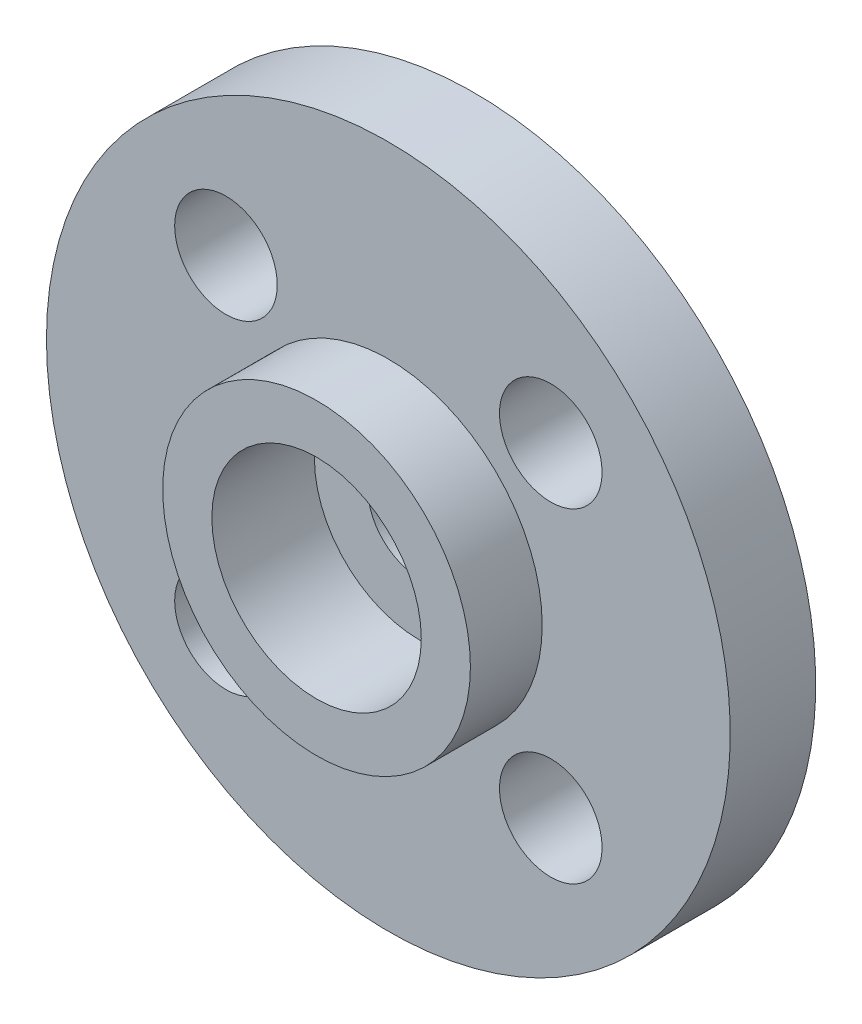
ISO-10303-21;
HEADER;
FILE_DESCRIPTION(('STEP AP214'),'2;1');
FILE_NAME('part.step','',(''),(''),'','','');
FILE_SCHEMA(('AUTOMOTIVE_DESIGN { 1 0 10303 214 1 1 1 1 }'));
ENDSEC;
DATA;
#1=APPLICATION_CONTEXT('core data for automotive mechanical design processes');
#2=APPLICATION_PROTOCOL_DEFINITION('international standard','automotive_design',2000,#1);
#3=PRODUCT_CONTEXT('',#1,'mechanical');
#4=PRODUCT('Part','Part','',(#3));
#5=PRODUCT_RELATED_PRODUCT_CATEGORY('part','',(#4));
#6=PRODUCT_DEFINITION_FORMATION('','',#4);
#7=PRODUCT_DEFINITION_CONTEXT('part definition',#1,'design');
#8=PRODUCT_DEFINITION('design','',#6,#7);
#9=PRODUCT_DEFINITION_SHAPE('','',#8);
#10=(LENGTH_UNIT() NAMED_UNIT(*) SI_UNIT(.MILLI.,.METRE.));
#11=(NAMED_UNIT(*) PLANE_ANGLE_UNIT() SI_UNIT($,.RADIAN.));
#12=(NAMED_UNIT(*) SI_UNIT($,.STERADIAN.) SOLID_ANGLE_UNIT());
#13=UNCERTAINTY_MEASURE_WITH_UNIT(LENGTH_MEASURE(1.E-05),#10,'distance_accuracy_value','');
#14=(GEOMETRIC_REPRESENTATION_CONTEXT(3) GLOBAL_UNCERTAINTY_ASSIGNED_CONTEXT((#13)) GLOBAL_UNIT_ASSIGNED_CONTEXT((#10,
#11,#12)) REPRESENTATION_CONTEXT('',''));
#15=CARTESIAN_POINT('',(0.,0.,0.));
#16=DIRECTION('',(0.,0.,1.));
#17=DIRECTION('',(1.,0.,0.));
#18=AXIS2_PLACEMENT_3D('',#15,#16,#17);
#19=CARTESIAN_POINT('',(0.,0.,2.5));
#20=DIRECTION('',(0.,0.,-1.));
#21=DIRECTION('',(-1.,0.,0.));
#22=AXIS2_PLACEMENT_3D('',#19,#20,#21);
#23=CYLINDRICAL_SURFACE('',#22,10.);
#24=CARTESIAN_POINT('',(0.,0.,2.5));
#25=DIRECTION('',(0.,0.,-1.));
#26=DIRECTION('',(-1.,0.,0.));
#27=AXIS2_PLACEMENT_3D('',#24,#25,#26);
#28=CIRCLE('',#27,10.);
#29=CARTESIAN_POINT('',(-10.,0.,2.5));
#30=VERTEX_POINT('',#29);
#31=EDGE_CURVE('E46',#30,#30,#28,.T.);
#32=ORIENTED_EDGE('',*,*,#31,.T.);
#33=EDGE_LOOP('',(#32));
#34=FACE_BOUND('',#33,.T.);
#35=CARTESIAN_POINT('',(0.,0.,0.));
#36=DIRECTION('',(0.,0.,-1.));
#37=DIRECTION('',(-1.,0.,0.));
#38=AXIS2_PLACEMENT_3D('',#35,#36,#37);
#39=CIRCLE('',#38,10.);
#40=CARTESIAN_POINT('',(-10.,0.,0.));
#41=VERTEX_POINT('',#40);
#42=EDGE_CURVE('E51',#41,#41,#39,.T.);
#43=ORIENTED_EDGE('',*,*,#42,.F.);
#44=EDGE_LOOP('',(#43));
#45=FACE_BOUND('',#44,.T.);
#46=ADVANCED_FACE('F39',(#34,#45),#23,.T.);
#47=CARTESIAN_POINT('',(10.,0.,2.5));
#48=DIRECTION('',(0.,0.,1.));
#49=DIRECTION('',(1.,0.,0.));
#50=AXIS2_PLACEMENT_3D('',#47,#48,#49);
#51=PLANE('',#50);
#52=CARTESIAN_POINT('',(4.75,-4.75,2.5));
#53=DIRECTION('',(0.,0.,1.));
#54=DIRECTION('',(1.,0.,0.));
#55=AXIS2_PLACEMENT_3D('',#52,#53,#54);
#56=CIRCLE('',#55,1.49999999999999);
#57=CARTESIAN_POINT('',(6.24999999999999,-4.75,2.5));
#58=VERTEX_POINT('',#57);
#59=EDGE_CURVE('E42',#58,#58,#56,.T.);
#60=ORIENTED_EDGE('',*,*,#59,.F.);
#61=EDGE_LOOP('',(#60));
#62=FACE_BOUND('',#61,.T.);
#63=CARTESIAN_POINT('',(-4.75,-4.75,2.5));
#64=DIRECTION('',(0.,0.,1.));
#65=DIRECTION('',(1.,0.,0.));
#66=AXIS2_PLACEMENT_3D('',#63,#64,#65);
#67=CIRCLE('',#66,1.49999999999999);
#68=CARTESIAN_POINT('',(-3.25000000000001,-4.75,2.5));
#69=VERTEX_POINT('',#68);
#70=EDGE_CURVE('E76',#69,#69,#67,.T.);
#71=ORIENTED_EDGE('',*,*,#70,.F.);
#72=EDGE_LOOP('',(#71));
#73=FACE_BOUND('',#72,.T.);
#74=CARTESIAN_POINT('',(-4.75,4.75,2.5));
#75=DIRECTION('',(0.,0.,1.));
#76=DIRECTION('',(1.,0.,0.));
#77=AXIS2_PLACEMENT_3D('',#74,#75,#76);
#78=CIRCLE('',#77,1.49999999999999);
#79=CARTESIAN_POINT('',(-3.25000000000001,4.75,2.5));
#80=VERTEX_POINT('',#79);
#81=EDGE_CURVE('E68',#80,#80,#78,.T.);
#82=ORIENTED_EDGE('',*,*,#81,.F.);
#83=EDGE_LOOP('',(#82));
#84=FACE_BOUND('',#83,.T.);
#85=CARTESIAN_POINT('',(4.75,4.75,2.5));
#86=DIRECTION('',(0.,0.,1.));
#87=DIRECTION('',(1.,0.,0.));
#88=AXIS2_PLACEMENT_3D('',#85,#86,#87);
#89=CIRCLE('',#88,1.49999999999999);
#90=CARTESIAN_POINT('',(6.24999999999999,4.75,2.5));
#91=VERTEX_POINT('',#90);
#92=EDGE_CURVE('E60',#91,#91,#89,.T.);
#93=ORIENTED_EDGE('',*,*,#92,.F.);
#94=EDGE_LOOP('',(#93));
#95=FACE_BOUND('',#94,.T.);
#96=CARTESIAN_POINT('',(0.,0.,2.5));
#97=DIRECTION('',(0.,0.,1.));
#98=DIRECTION('',(1.,0.,0.));
#99=AXIS2_PLACEMENT_3D('',#96,#97,#98);
#100=CIRCLE('',#99,4.5);
#101=CARTESIAN_POINT('',(4.5,0.,2.5));
#102=VERTEX_POINT('',#101);
#103=EDGE_CURVE('E10',#102,#102,#100,.T.);
#104=ORIENTED_EDGE('',*,*,#103,.F.);
#105=EDGE_LOOP('',(#104));
#106=FACE_BOUND('',#105,.T.);
#107=ORIENTED_EDGE('',*,*,#31,.F.);
#108=EDGE_LOOP('',(#107));
#109=FACE_BOUND('',#108,.T.);
#110=ADVANCED_FACE('F115',(#62,#73,#84,#95,#106,#109),#51,.T.);
#111=CARTESIAN_POINT('',(0.,0.,0.));
#112=DIRECTION('',(0.,0.,-1.));
#113=DIRECTION('',(-1.,0.,0.));
#114=AXIS2_PLACEMENT_3D('',#111,#112,#113);
#115=PLANE('',#114);
#116=CARTESIAN_POINT('',(0.,0.,0.));
#117=DIRECTION('',(0.,0.,1.));
#118=DIRECTION('',(1.,0.,0.));
#119=AXIS2_PLACEMENT_3D('',#116,#117,#118);
#120=CIRCLE('',#119,1.50000000000001);
#121=CARTESIAN_POINT('',(1.50000000000001,0.,0.));
#122=VERTEX_POINT('',#121);
#123=EDGE_CURVE('E85',#122,#122,#120,.T.);
#124=ORIENTED_EDGE('',*,*,#123,.T.);
#125=EDGE_LOOP('',(#124));
#126=FACE_BOUND('',#125,.T.);
#127=CARTESIAN_POINT('',(4.75,-4.75,0.));
#128=DIRECTION('',(0.,0.,-1.));
#129=DIRECTION('',(-1.,0.,0.));
#130=AXIS2_PLACEMENT_3D('',#127,#128,#129);
#131=CIRCLE('',#130,1.49999999999999);
#132=CARTESIAN_POINT('',(3.25000000000001,-4.75,0.));
#133=VERTEX_POINT('',#132);
#134=EDGE_CURVE('E82',#133,#133,#131,.T.);
#135=ORIENTED_EDGE('',*,*,#134,.F.);
#136=EDGE_LOOP('',(#135));
#137=FACE_BOUND('',#136,.T.);
#138=CARTESIAN_POINT('',(-4.75,-4.75,0.));
#139=DIRECTION('',(0.,0.,-1.));
#140=DIRECTION('',(-1.,0.,0.));
#141=AXIS2_PLACEMENT_3D('',#138,#139,#140);
#142=CIRCLE('',#141,1.49999999999999);
#143=CARTESIAN_POINT('',(-6.24999999999999,-4.75,0.));
#144=VERTEX_POINT('',#143);
#145=EDGE_CURVE('E79',#144,#144,#142,.T.);
#146=ORIENTED_EDGE('',*,*,#145,.F.);
#147=EDGE_LOOP('',(#146));
#148=FACE_BOUND('',#147,.T.);
#149=CARTESIAN_POINT('',(-4.75,4.75,0.));
#150=DIRECTION('',(0.,0.,-1.));
#151=DIRECTION('',(-1.,0.,0.));
#152=AXIS2_PLACEMENT_3D('',#149,#150,#151);
#153=CIRCLE('',#152,1.49999999999999);
#154=CARTESIAN_POINT('',(-6.24999999999999,4.75,0.));
#155=VERTEX_POINT('',#154);
#156=EDGE_CURVE('E73',#155,#155,#153,.T.);
#157=ORIENTED_EDGE('',*,*,#156,.F.);
#158=EDGE_LOOP('',(#157));
#159=FACE_BOUND('',#158,.T.);
#160=CARTESIAN_POINT('',(4.75,4.75,0.));
#161=DIRECTION('',(0.,0.,-1.));
#162=DIRECTION('',(-1.,0.,0.));
#163=AXIS2_PLACEMENT_3D('',#160,#161,#162);
#164=CIRCLE('',#163,1.49999999999999);
#165=CARTESIAN_POINT('',(3.25000000000001,4.75,0.));
#166=VERTEX_POINT('',#165);
#167=EDGE_CURVE('E64',#166,#166,#164,.T.);
#168=ORIENTED_EDGE('',*,*,#167,.F.);
#169=EDGE_LOOP('',(#168));
#170=FACE_BOUND('',#169,.T.);
#171=ORIENTED_EDGE('',*,*,#42,.T.);
#172=EDGE_LOOP('',(#171));
#173=FACE_BOUND('',#172,.T.);
#174=ADVANCED_FACE('F111',(#126,#137,#148,#159,#170,#173),#115,.T.);
#175=CARTESIAN_POINT('',(0.,0.,4.6));
#176=DIRECTION('',(0.,0.,-1.));
#177=DIRECTION('',(-1.,0.,0.));
#178=AXIS2_PLACEMENT_3D('',#175,#176,#177);
#179=CYLINDRICAL_SURFACE('',#178,4.5);
#180=CARTESIAN_POINT('',(0.,0.,4.6));
#181=DIRECTION('',(0.,0.,1.));
#182=DIRECTION('',(1.,0.,0.));
#183=AXIS2_PLACEMENT_3D('',#180,#181,#182);
#184=CIRCLE('',#183,4.5);
#185=CARTESIAN_POINT('',(4.5,0.,4.6));
#186=VERTEX_POINT('',#185);
#187=EDGE_CURVE('E54',#186,#186,#184,.T.);
#188=ORIENTED_EDGE('',*,*,#187,.F.);
#189=EDGE_LOOP('',(#188));
#190=FACE_BOUND('',#189,.T.);
#191=ORIENTED_EDGE('',*,*,#103,.T.);
#192=EDGE_LOOP('',(#191));
#193=FACE_BOUND('',#192,.T.);
#194=ADVANCED_FACE('F103',(#190,#193),#179,.T.);
#195=CARTESIAN_POINT('',(0.,0.,4.6));
#196=DIRECTION('',(0.,0.,1.));
#197=DIRECTION('',(1.,0.,0.));
#198=AXIS2_PLACEMENT_3D('',#195,#196,#197);
#199=PLANE('',#198);
#200=CARTESIAN_POINT('',(0.,0.,4.6));
#201=DIRECTION('',(0.,0.,1.));
#202=DIRECTION('',(1.,0.,0.));
#203=AXIS2_PLACEMENT_3D('',#200,#201,#202);
#204=CIRCLE('',#203,3.06304624364247);
#205=CARTESIAN_POINT('',(3.06304624364247,0.,4.6));
#206=VERTEX_POINT('',#205);
#207=EDGE_CURVE('E94',#206,#206,#204,.T.);
#208=ORIENTED_EDGE('',*,*,#207,.F.);
#209=EDGE_LOOP('',(#208));
#210=FACE_BOUND('',#209,.T.);
#211=ORIENTED_EDGE('',*,*,#187,.T.);
#212=EDGE_LOOP('',(#211));
#213=FACE_BOUND('',#212,.T.);
#214=ADVANCED_FACE('F100',(#210,#213),#199,.T.);
#215=CARTESIAN_POINT('',(4.75,4.75,0.));
#216=DIRECTION('',(0.,0.,-1.));
#217=DIRECTION('',(-1.,0.,0.));
#218=AXIS2_PLACEMENT_3D('',#215,#216,#217);
#219=CYLINDRICAL_SURFACE('',#218,1.49999999999999);
#220=ORIENTED_EDGE('',*,*,#92,.T.);
#221=EDGE_LOOP('',(#220));
#222=FACE_BOUND('',#221,.T.);
#223=ORIENTED_EDGE('',*,*,#167,.T.);
#224=EDGE_LOOP('',(#223));
#225=FACE_BOUND('',#224,.T.);
#226=ADVANCED_FACE('F102',(#222,#225),#219,.F.);
#227=CARTESIAN_POINT('',(-4.75,4.75,0.));
#228=DIRECTION('',(0.,0.,-1.));
#229=DIRECTION('',(-1.,0.,0.));
#230=AXIS2_PLACEMENT_3D('',#227,#228,#229);
#231=CYLINDRICAL_SURFACE('',#230,1.49999999999999);
#232=ORIENTED_EDGE('',*,*,#81,.T.);
#233=EDGE_LOOP('',(#232));
#234=FACE_BOUND('',#233,.T.);
#235=ORIENTED_EDGE('',*,*,#156,.T.);
#236=EDGE_LOOP('',(#235));
#237=FACE_BOUND('',#236,.T.);
#238=ADVANCED_FACE('F109',(#234,#237),#231,.F.);
#239=CARTESIAN_POINT('',(-4.75,-4.75,0.));
#240=DIRECTION('',(0.,0.,-1.));
#241=DIRECTION('',(-1.,0.,0.));
#242=AXIS2_PLACEMENT_3D('',#239,#240,#241);
#243=CYLINDRICAL_SURFACE('',#242,1.49999999999999);
#244=ORIENTED_EDGE('',*,*,#70,.T.);
#245=EDGE_LOOP('',(#244));
#246=FACE_BOUND('',#245,.T.);
#247=ORIENTED_EDGE('',*,*,#145,.T.);
#248=EDGE_LOOP('',(#247));
#249=FACE_BOUND('',#248,.T.);
#250=ADVANCED_FACE('F140',(#246,#249),#243,.F.);
#251=CARTESIAN_POINT('',(4.75,-4.75,0.));
#252=DIRECTION('',(0.,0.,-1.));
#253=DIRECTION('',(-1.,0.,0.));
#254=AXIS2_PLACEMENT_3D('',#251,#252,#253);
#255=CYLINDRICAL_SURFACE('',#254,1.49999999999999);
#256=ORIENTED_EDGE('',*,*,#59,.T.);
#257=EDGE_LOOP('',(#256));
#258=FACE_BOUND('',#257,.T.);
#259=ORIENTED_EDGE('',*,*,#134,.T.);
#260=EDGE_LOOP('',(#259));
#261=FACE_BOUND('',#260,.T.);
#262=ADVANCED_FACE('F150',(#258,#261),#255,.F.);
#263=CARTESIAN_POINT('',(0.,0.,4.6));
#264=DIRECTION('',(0.,0.,1.));
#265=DIRECTION('',(1.,0.,0.));
#266=AXIS2_PLACEMENT_3D('',#263,#264,#265);
#267=CYLINDRICAL_SURFACE('',#266,1.50000000000001);
#268=ORIENTED_EDGE('',*,*,#123,.F.);
#269=EDGE_LOOP('',(#268));
#270=FACE_BOUND('',#269,.T.);
#271=CARTESIAN_POINT('',(0.,0.,1.6));
#272=DIRECTION('',(0.,0.,1.));
#273=DIRECTION('',(1.,0.,0.));
#274=AXIS2_PLACEMENT_3D('',#271,#272,#273);
#275=CIRCLE('',#274,1.50000000000001);
#276=CARTESIAN_POINT('',(1.50000000000001,0.,1.6));
#277=VERTEX_POINT('',#276);
#278=EDGE_CURVE('E88',#277,#277,#275,.T.);
#279=ORIENTED_EDGE('',*,*,#278,.T.);
#280=EDGE_LOOP('',(#279));
#281=FACE_BOUND('',#280,.T.);
#282=ADVANCED_FACE('F156',(#270,#281),#267,.F.);
#283=CARTESIAN_POINT('',(1.50000000000001,0.,1.6));
#284=DIRECTION('',(0.,0.,-1.));
#285=DIRECTION('',(-1.,0.,0.));
#286=AXIS2_PLACEMENT_3D('',#283,#284,#285);
#287=PLANE('',#286);
#288=ORIENTED_EDGE('',*,*,#278,.F.);
#289=EDGE_LOOP('',(#288));
#290=FACE_BOUND('',#289,.T.);
#291=CARTESIAN_POINT('',(0.,0.,1.6));
#292=DIRECTION('',(0.,0.,1.));
#293=DIRECTION('',(1.,0.,0.));
#294=AXIS2_PLACEMENT_3D('',#291,#292,#293);
#295=CIRCLE('',#294,3.06304624364247);
#296=CARTESIAN_POINT('',(3.06304624364247,0.,1.6));
#297=VERTEX_POINT('',#296);
#298=EDGE_CURVE('E91',#297,#297,#295,.T.);
#299=ORIENTED_EDGE('',*,*,#298,.T.);
#300=EDGE_LOOP('',(#299));
#301=FACE_BOUND('',#300,.T.);
#302=ADVANCED_FACE('F160',(#290,#301),#287,.F.);
#303=CARTESIAN_POINT('',(0.,0.,4.6));
#304=DIRECTION('',(0.,0.,1.));
#305=DIRECTION('',(1.,0.,0.));
#306=AXIS2_PLACEMENT_3D('',#303,#304,#305);
#307=CYLINDRICAL_SURFACE('',#306,3.06304624364247);
#308=ORIENTED_EDGE('',*,*,#298,.F.);
#309=EDGE_LOOP('',(#308));
#310=FACE_BOUND('',#309,.T.);
#311=ORIENTED_EDGE('',*,*,#207,.T.);
#312=EDGE_LOOP('',(#311));
#313=FACE_BOUND('',#312,.T.);
#314=ADVANCED_FACE('F98',(#310,#313),#307,.F.);
#315=CLOSED_SHELL('',(#46,#110,#174,#194,#214,#226,#238,#250,#262,#282,#302,#314));
#316=MANIFOLD_SOLID_BREP('B2',#315);
#317=ADVANCED_BREP_SHAPE_REPRESENTATION('',(#18,#316),#14);
#318=SHAPE_DEFINITION_REPRESENTATION(#9,#317);
ENDSEC;
END-ISO-10303-21;
